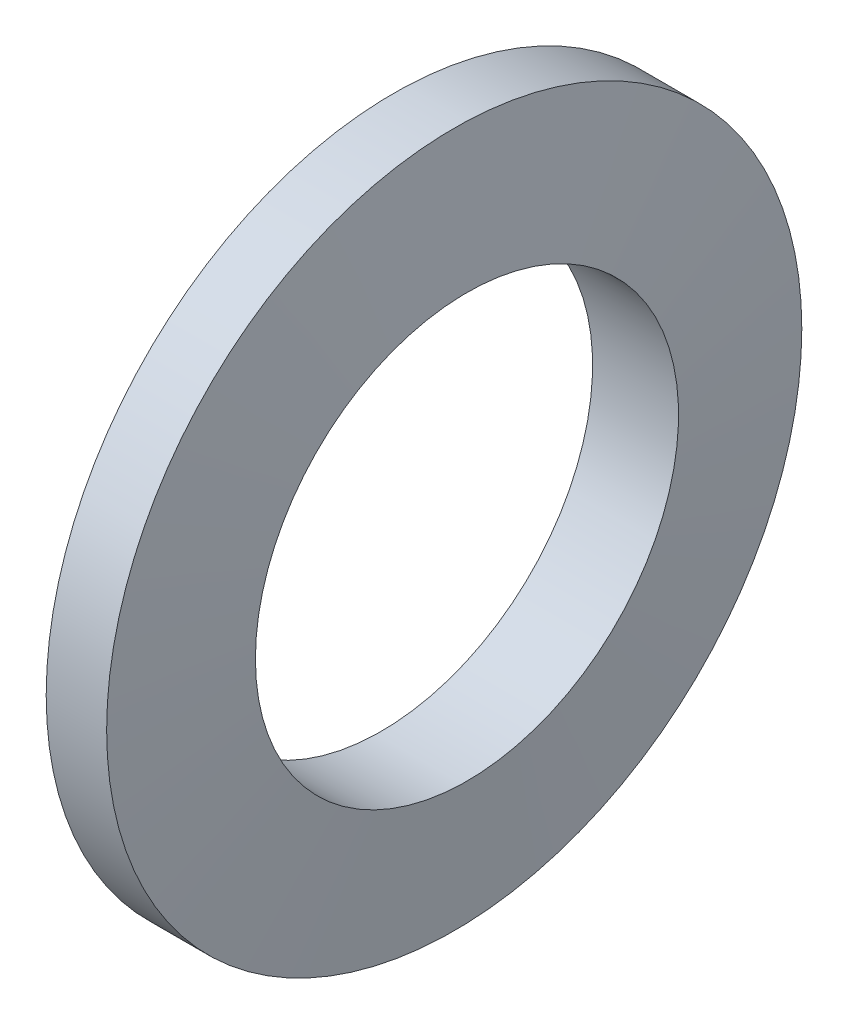
ISO-10303-21;
HEADER;
FILE_DESCRIPTION(('STEP AP214'),'2;1');
FILE_NAME('part.step','',(''),(''),'','','');
FILE_SCHEMA(('AUTOMOTIVE_DESIGN { 1 0 10303 214 1 1 1 1 }'));
ENDSEC;
DATA;
#1=APPLICATION_CONTEXT('core data for automotive mechanical design processes');
#2=APPLICATION_PROTOCOL_DEFINITION('international standard','automotive_design',2000,#1);
#3=PRODUCT_CONTEXT('',#1,'mechanical');
#4=PRODUCT('Part','Part','',(#3));
#5=PRODUCT_RELATED_PRODUCT_CATEGORY('part','',(#4));
#6=PRODUCT_DEFINITION_FORMATION('','',#4);
#7=PRODUCT_DEFINITION_CONTEXT('part definition',#1,'design');
#8=PRODUCT_DEFINITION('design','',#6,#7);
#9=PRODUCT_DEFINITION_SHAPE('','',#8);
#10=(LENGTH_UNIT() NAMED_UNIT(*) SI_UNIT(.MILLI.,.METRE.));
#11=(NAMED_UNIT(*) PLANE_ANGLE_UNIT() SI_UNIT($,.RADIAN.));
#12=(NAMED_UNIT(*) SI_UNIT($,.STERADIAN.) SOLID_ANGLE_UNIT());
#13=UNCERTAINTY_MEASURE_WITH_UNIT(LENGTH_MEASURE(1.E-05),#10,'distance_accuracy_value','');
#14=(GEOMETRIC_REPRESENTATION_CONTEXT(3) GLOBAL_UNCERTAINTY_ASSIGNED_CONTEXT((#13)) GLOBAL_UNIT_ASSIGNED_CONTEXT((#10,
#11,#12)) REPRESENTATION_CONTEXT('',''));
#15=CARTESIAN_POINT('',(0.,0.,0.));
#16=DIRECTION('',(0.,0.,1.));
#17=DIRECTION('',(1.,0.,0.));
#18=AXIS2_PLACEMENT_3D('',#15,#16,#17);
#19=CARTESIAN_POINT('',(2.84375,0.,0.));
#20=DIRECTION('',(-1.,0.,0.));
#21=DIRECTION('',(0.,0.,1.));
#22=AXIS2_PLACEMENT_3D('',#19,#20,#21);
#23=CONICAL_SURFACE('',#22,14.,1.47731954563631);
#24=CARTESIAN_POINT('',(2.,0.,0.));
#25=DIRECTION('',(-1.,0.,0.));
#26=DIRECTION('',(0.,0.,1.));
#27=AXIS2_PLACEMENT_3D('',#24,#25,#26);
#28=CIRCLE('',#27,23.);
#29=CARTESIAN_POINT('',(2.,0.,23.));
#30=VERTEX_POINT('',#29);
#31=EDGE_CURVE('E62',#30,#30,#28,.T.);
#32=ORIENTED_EDGE('',*,*,#31,.F.);
#33=EDGE_LOOP('',(#32));
#34=FACE_BOUND('',#33,.T.);
#35=CARTESIAN_POINT('',(2.84375,0.,0.));
#36=DIRECTION('',(-1.,0.,0.));
#37=DIRECTION('',(0.,0.,1.));
#38=AXIS2_PLACEMENT_3D('',#35,#36,#37);
#39=CIRCLE('',#38,14.);
#40=CARTESIAN_POINT('',(2.84375,0.,14.));
#41=VERTEX_POINT('',#40);
#42=EDGE_CURVE('E10',#41,#41,#39,.T.);
#43=ORIENTED_EDGE('',*,*,#42,.T.);
#44=EDGE_LOOP('',(#43));
#45=FACE_BOUND('',#44,.T.);
#46=ADVANCED_FACE('F43',(#34,#45),#23,.T.);
#47=CARTESIAN_POINT('',(0.,0.,0.));
#48=DIRECTION('',(-1.,0.,0.));
#49=DIRECTION('',(0.,0.,1.));
#50=AXIS2_PLACEMENT_3D('',#47,#48,#49);
#51=CYLINDRICAL_SURFACE('',#50,14.);
#52=ORIENTED_EDGE('',*,*,#42,.F.);
#53=EDGE_LOOP('',(#52));
#54=FACE_BOUND('',#53,.T.);
#55=CARTESIAN_POINT('',(-2.84375,0.,0.));
#56=DIRECTION('',(-1.,0.,0.));
#57=DIRECTION('',(0.,0.,1.));
#58=AXIS2_PLACEMENT_3D('',#55,#56,#57);
#59=CIRCLE('',#58,14.);
#60=CARTESIAN_POINT('',(-2.84375,0.,14.));
#61=VERTEX_POINT('',#60);
#62=EDGE_CURVE('E50',#61,#61,#59,.T.);
#63=ORIENTED_EDGE('',*,*,#62,.T.);
#64=EDGE_LOOP('',(#63));
#65=FACE_BOUND('',#64,.T.);
#66=ADVANCED_FACE('F73',(#54,#65),#51,.F.);
#67=CARTESIAN_POINT('',(-2.,0.,0.));
#68=DIRECTION('',(1.,0.,0.));
#69=DIRECTION('',(0.,0.,-1.));
#70=AXIS2_PLACEMENT_3D('',#67,#68,#69);
#71=CONICAL_SURFACE('',#70,23.,1.47731954563631);
#72=ORIENTED_EDGE('',*,*,#62,.F.);
#73=EDGE_LOOP('',(#72));
#74=FACE_BOUND('',#73,.T.);
#75=CARTESIAN_POINT('',(-2.,0.,0.));
#76=DIRECTION('',(-1.,0.,0.));
#77=DIRECTION('',(0.,0.,1.));
#78=AXIS2_PLACEMENT_3D('',#75,#76,#77);
#79=CIRCLE('',#78,23.);
#80=CARTESIAN_POINT('',(-2.,0.,23.));
#81=VERTEX_POINT('',#80);
#82=EDGE_CURVE('E56',#81,#81,#79,.T.);
#83=ORIENTED_EDGE('',*,*,#82,.T.);
#84=EDGE_LOOP('',(#83));
#85=FACE_BOUND('',#84,.T.);
#86=ADVANCED_FACE('F77',(#74,#85),#71,.T.);
#87=CARTESIAN_POINT('',(0.,0.,0.));
#88=DIRECTION('',(-1.,0.,0.));
#89=DIRECTION('',(0.,0.,1.));
#90=AXIS2_PLACEMENT_3D('',#87,#88,#89);
#91=CYLINDRICAL_SURFACE('',#90,23.);
#92=ORIENTED_EDGE('',*,*,#82,.F.);
#93=EDGE_LOOP('',(#92));
#94=FACE_BOUND('',#93,.T.);
#95=ORIENTED_EDGE('',*,*,#31,.T.);
#96=EDGE_LOOP('',(#95));
#97=FACE_BOUND('',#96,.T.);
#98=ADVANCED_FACE('F70',(#94,#97),#91,.T.);
#99=CLOSED_SHELL('',(#46,#66,#86,#98));
#100=MANIFOLD_SOLID_BREP('B2',#99);
#101=ADVANCED_BREP_SHAPE_REPRESENTATION('',(#18,#100),#14);
#102=SHAPE_DEFINITION_REPRESENTATION(#9,#101);
ENDSEC;
END-ISO-10303-21;
